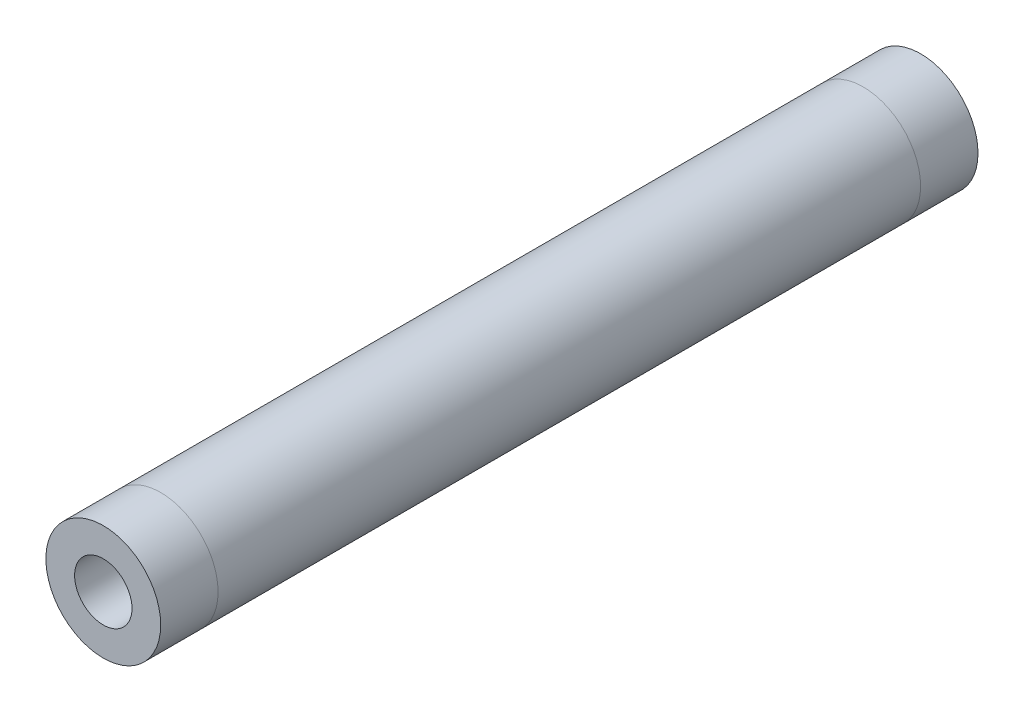
ISO-10303-21;
HEADER;
FILE_DESCRIPTION(('STEP AP214'),'2;1');
FILE_NAME('part.step','',(''),(''),'','','');
FILE_SCHEMA(('AUTOMOTIVE_DESIGN { 1 0 10303 214 1 1 1 1 }'));
ENDSEC;
DATA;
#1=APPLICATION_CONTEXT('core data for automotive mechanical design processes');
#2=APPLICATION_PROTOCOL_DEFINITION('international standard','automotive_design',2000,#1);
#3=PRODUCT_CONTEXT('',#1,'mechanical');
#4=PRODUCT('Part','Part','',(#3));
#5=PRODUCT_RELATED_PRODUCT_CATEGORY('part','',(#4));
#6=PRODUCT_DEFINITION_FORMATION('','',#4);
#7=PRODUCT_DEFINITION_CONTEXT('part definition',#1,'design');
#8=PRODUCT_DEFINITION('design','',#6,#7);
#9=PRODUCT_DEFINITION_SHAPE('','',#8);
#10=(LENGTH_UNIT() NAMED_UNIT(*) SI_UNIT(.MILLI.,.METRE.));
#11=(NAMED_UNIT(*) PLANE_ANGLE_UNIT() SI_UNIT($,.RADIAN.));
#12=(NAMED_UNIT(*) SI_UNIT($,.STERADIAN.) SOLID_ANGLE_UNIT());
#13=UNCERTAINTY_MEASURE_WITH_UNIT(LENGTH_MEASURE(1.E-05),#10,'distance_accuracy_value','');
#14=(GEOMETRIC_REPRESENTATION_CONTEXT(3) GLOBAL_UNCERTAINTY_ASSIGNED_CONTEXT((#13)) GLOBAL_UNIT_ASSIGNED_CONTEXT((#10,
#11,#12)) REPRESENTATION_CONTEXT('',''));
#15=CARTESIAN_POINT('',(0.,0.,0.));
#16=DIRECTION('',(0.,0.,1.));
#17=DIRECTION('',(1.,0.,0.));
#18=AXIS2_PLACEMENT_3D('',#15,#16,#17);
#19=CARTESIAN_POINT('',(0.,0.,-123.938697034138));
#20=DIRECTION('',(0.,0.,1.));
#21=DIRECTION('',(1.,0.,0.));
#22=AXIS2_PLACEMENT_3D('',#19,#20,#21);
#23=CYLINDRICAL_SURFACE('',#22,6.35);
#24=CARTESIAN_POINT('',(0.,0.,-105.978184792));
#25=DIRECTION('',(0.,0.,1.));
#26=DIRECTION('',(1.,0.,0.));
#27=AXIS2_PLACEMENT_3D('',#24,#25,#26);
#28=CIRCLE('',#27,6.35);
#29=CARTESIAN_POINT('',(6.35,0.,-105.978184792));
#30=VERTEX_POINT('',#29);
#31=EDGE_CURVE('E12',#30,#30,#28,.F.);
#32=ORIENTED_EDGE('',*,*,#31,.F.);
#33=EDGE_LOOP('',(#32));
#34=FACE_BOUND('',#33,.T.);
#35=CARTESIAN_POINT('',(0.,0.,-28.2575));
#36=DIRECTION('',(0.,0.,1.));
#37=DIRECTION('',(1.,0.,0.));
#38=AXIS2_PLACEMENT_3D('',#35,#36,#37);
#39=CIRCLE('',#38,6.35);
#40=CARTESIAN_POINT('',(6.35,0.,-28.2575));
#41=VERTEX_POINT('',#40);
#42=EDGE_CURVE('E78',#41,#41,#39,.T.);
#43=ORIENTED_EDGE('',*,*,#42,.F.);
#44=EDGE_LOOP('',(#43));
#45=FACE_BOUND('',#44,.T.);
#46=ADVANCED_FACE('F67',(#34,#45),#23,.T.);
#47=CARTESIAN_POINT('',(0.,0.,-28.2575));
#48=DIRECTION('',(0.,0.,1.));
#49=DIRECTION('',(1.,0.,0.));
#50=AXIS2_PLACEMENT_3D('',#47,#48,#49);
#51=PLANE('',#50);
#52=CARTESIAN_POINT('',(0.,0.,-28.2575));
#53=DIRECTION('',(0.,0.,1.));
#54=DIRECTION('',(1.,0.,0.));
#55=AXIS2_PLACEMENT_3D('',#52,#53,#54);
#56=CIRCLE('',#55,4.7625);
#57=CARTESIAN_POINT('',(4.7625,0.,-28.2575));
#58=VERTEX_POINT('',#57);
#59=EDGE_CURVE('E80',#58,#58,#56,.T.);
#60=ORIENTED_EDGE('',*,*,#59,.F.);
#61=EDGE_LOOP('',(#60));
#62=FACE_BOUND('',#61,.T.);
#63=ORIENTED_EDGE('',*,*,#42,.T.);
#64=EDGE_LOOP('',(#63));
#65=FACE_BOUND('',#64,.T.);
#66=ADVANCED_FACE('F85',(#62,#65),#51,.T.);
#67=CARTESIAN_POINT('',(0.,0.,-123.938697034138));
#68=DIRECTION('',(0.,0.,1.));
#69=DIRECTION('',(1.,0.,0.));
#70=AXIS2_PLACEMENT_3D('',#67,#68,#69);
#71=CYLINDRICAL_SURFACE('',#70,4.7625);
#72=CARTESIAN_POINT('',(0.,0.,-105.978184792));
#73=DIRECTION('',(0.,0.,1.));
#74=DIRECTION('',(1.,0.,0.));
#75=AXIS2_PLACEMENT_3D('',#72,#73,#74);
#76=CIRCLE('',#75,4.7625);
#77=CARTESIAN_POINT('',(4.7625,0.,-105.978184792));
#78=VERTEX_POINT('',#77);
#79=EDGE_CURVE('E70',#78,#78,#76,.F.);
#80=ORIENTED_EDGE('',*,*,#79,.T.);
#81=EDGE_LOOP('',(#80));
#82=FACE_BOUND('',#81,.T.);
#83=ORIENTED_EDGE('',*,*,#59,.T.);
#84=EDGE_LOOP('',(#83));
#85=FACE_BOUND('',#84,.T.);
#86=ADVANCED_FACE('F92',(#82,#85),#71,.F.);
#87=CARTESIAN_POINT('',(0.,0.,-105.978184792));
#88=DIRECTION('',(0.,0.,1.));
#89=DIRECTION('',(1.,0.,0.));
#90=AXIS2_PLACEMENT_3D('',#87,#88,#89);
#91=PLANE('',#90);
#92=ORIENTED_EDGE('',*,*,#31,.T.);
#93=EDGE_LOOP('',(#92));
#94=FACE_BOUND('',#93,.T.);
#95=ORIENTED_EDGE('',*,*,#79,.F.);
#96=EDGE_LOOP('',(#95));
#97=FACE_BOUND('',#96,.T.);
#98=ADVANCED_FACE('F97',(#94,#97),#91,.F.);
#99=CLOSED_SHELL('',(#46,#66,#86,#98));
#100=MANIFOLD_SOLID_BREP('B2',#99);
#101=CARTESIAN_POINT('',(0.,0.,-105.978184792));
#102=DIRECTION('',(0.,0.,1.));
#103=DIRECTION('',(1.,0.,0.));
#104=AXIS2_PLACEMENT_3D('',#101,#102,#103);
#105=PLANE('',#104);
#106=CARTESIAN_POINT('',(0.,0.,-105.978184792));
#107=DIRECTION('',(0.,0.,1.));
#108=DIRECTION('',(1.,0.,0.));
#109=AXIS2_PLACEMENT_3D('',#106,#107,#108);
#110=CIRCLE('',#109,6.35);
#111=CARTESIAN_POINT('',(6.35,0.,-105.978184792));
#112=VERTEX_POINT('',#111);
#113=EDGE_CURVE('E66',#112,#112,#110,.T.);
#114=ORIENTED_EDGE('',*,*,#113,.T.);
#115=EDGE_LOOP('',(#114));
#116=FACE_BOUND('',#115,.T.);
#117=CARTESIAN_POINT('',(0.,0.,-105.978184792));
#118=DIRECTION('',(0.,0.,1.));
#119=DIRECTION('',(1.,0.,0.));
#120=AXIS2_PLACEMENT_3D('',#117,#118,#119);
#121=CIRCLE('',#120,4.7625);
#122=CARTESIAN_POINT('',(4.7625,0.,-105.978184792));
#123=VERTEX_POINT('',#122);
#124=EDGE_CURVE('E149',#123,#123,#121,.T.);
#125=ORIENTED_EDGE('',*,*,#124,.F.);
#126=EDGE_LOOP('',(#125));
#127=FACE_BOUND('',#126,.T.);
#128=ADVANCED_FACE('F135',(#116,#127),#105,.T.);
#129=CARTESIAN_POINT('',(0.,0.,-105.978184792));
#130=DIRECTION('',(0.,0.,-1.));
#131=DIRECTION('',(-1.,0.,0.));
#132=AXIS2_PLACEMENT_3D('',#129,#130,#131);
#133=CYLINDRICAL_SURFACE('',#132,6.35);
#134=ORIENTED_EDGE('',*,*,#113,.F.);
#135=EDGE_LOOP('',(#134));
#136=FACE_BOUND('',#135,.T.);
#137=CARTESIAN_POINT('',(0.,0.,-112.328184792));
#138=DIRECTION('',(0.,0.,1.));
#139=DIRECTION('',(1.,0.,0.));
#140=AXIS2_PLACEMENT_3D('',#137,#138,#139);
#141=CIRCLE('',#140,6.35);
#142=CARTESIAN_POINT('',(6.35,0.,-112.328184792));
#143=VERTEX_POINT('',#142);
#144=EDGE_CURVE('E147',#143,#143,#141,.T.);
#145=ORIENTED_EDGE('',*,*,#144,.T.);
#146=EDGE_LOOP('',(#145));
#147=FACE_BOUND('',#146,.T.);
#148=ADVANCED_FACE('F137',(#136,#147),#133,.T.);
#149=CARTESIAN_POINT('',(0.,0.,-105.978184792));
#150=DIRECTION('',(0.,0.,-1.));
#151=DIRECTION('',(-1.,0.,0.));
#152=AXIS2_PLACEMENT_3D('',#149,#150,#151);
#153=CYLINDRICAL_SURFACE('',#152,3.175);
#154=CARTESIAN_POINT('',(0.,0.,-112.328184792));
#155=DIRECTION('',(0.,0.,1.));
#156=DIRECTION('',(1.,0.,0.));
#157=AXIS2_PLACEMENT_3D('',#154,#155,#156);
#158=CIRCLE('',#157,3.175);
#159=CARTESIAN_POINT('',(3.175,0.,-112.328184792));
#160=VERTEX_POINT('',#159);
#161=EDGE_CURVE('E139',#160,#160,#158,.T.);
#162=ORIENTED_EDGE('',*,*,#161,.F.);
#163=EDGE_LOOP('',(#162));
#164=FACE_BOUND('',#163,.T.);
#165=CARTESIAN_POINT('',(0.,0.,-99.628184792));
#166=DIRECTION('',(0.,0.,1.));
#167=DIRECTION('',(1.,0.,0.));
#168=AXIS2_PLACEMENT_3D('',#165,#166,#167);
#169=CIRCLE('',#168,3.175);
#170=CARTESIAN_POINT('',(3.175,0.,-99.628184792));
#171=VERTEX_POINT('',#170);
#172=EDGE_CURVE('E159',#171,#171,#169,.T.);
#173=ORIENTED_EDGE('',*,*,#172,.T.);
#174=EDGE_LOOP('',(#173));
#175=FACE_BOUND('',#174,.T.);
#176=ADVANCED_FACE('F164',(#164,#175),#153,.F.);
#177=CARTESIAN_POINT('',(0.,0.,-112.328184792));
#178=DIRECTION('',(0.,0.,1.));
#179=DIRECTION('',(1.,0.,0.));
#180=AXIS2_PLACEMENT_3D('',#177,#178,#179);
#181=PLANE('',#180);
#182=ORIENTED_EDGE('',*,*,#144,.F.);
#183=EDGE_LOOP('',(#182));
#184=FACE_BOUND('',#183,.T.);
#185=ORIENTED_EDGE('',*,*,#161,.T.);
#186=EDGE_LOOP('',(#185));
#187=FACE_BOUND('',#186,.T.);
#188=ADVANCED_FACE('F169',(#184,#187),#181,.F.);
#189=CARTESIAN_POINT('',(0.,0.,-99.628184792));
#190=DIRECTION('',(0.,0.,1.));
#191=DIRECTION('',(1.,0.,0.));
#192=AXIS2_PLACEMENT_3D('',#189,#190,#191);
#193=PLANE('',#192);
#194=CARTESIAN_POINT('',(0.,0.,-99.628184792));
#195=DIRECTION('',(0.,0.,1.));
#196=DIRECTION('',(1.,0.,0.));
#197=AXIS2_PLACEMENT_3D('',#194,#195,#196);
#198=CIRCLE('',#197,4.7625);
#199=CARTESIAN_POINT('',(4.7625,0.,-99.628184792));
#200=VERTEX_POINT('',#199);
#201=EDGE_CURVE('E152',#200,#200,#198,.T.);
#202=ORIENTED_EDGE('',*,*,#201,.T.);
#203=EDGE_LOOP('',(#202));
#204=FACE_BOUND('',#203,.T.);
#205=ORIENTED_EDGE('',*,*,#172,.F.);
#206=EDGE_LOOP('',(#205));
#207=FACE_BOUND('',#206,.T.);
#208=ADVANCED_FACE('F166',(#204,#207),#193,.T.);
#209=CARTESIAN_POINT('',(0.,0.,-99.628184792));
#210=DIRECTION('',(0.,0.,-1.));
#211=DIRECTION('',(-1.,0.,0.));
#212=AXIS2_PLACEMENT_3D('',#209,#210,#211);
#213=CYLINDRICAL_SURFACE('',#212,4.7625);
#214=ORIENTED_EDGE('',*,*,#201,.F.);
#215=EDGE_LOOP('',(#214));
#216=FACE_BOUND('',#215,.T.);
#217=ORIENTED_EDGE('',*,*,#124,.T.);
#218=EDGE_LOOP('',(#217));
#219=FACE_BOUND('',#218,.T.);
#220=ADVANCED_FACE('F168',(#216,#219),#213,.T.);
#221=CLOSED_SHELL('',(#128,#148,#176,#188,#208,#220));
#222=MANIFOLD_SOLID_BREP('B7',#221);
#223=CARTESIAN_POINT('',(0.,0.,-28.2575));
#224=DIRECTION('',(0.,0.,1.));
#225=DIRECTION('',(1.,0.,0.));
#226=AXIS2_PLACEMENT_3D('',#223,#224,#225);
#227=CYLINDRICAL_SURFACE('',#226,6.35);
#228=CARTESIAN_POINT('',(0.,0.,-28.2575));
#229=DIRECTION('',(0.,0.,1.));
#230=DIRECTION('',(1.,0.,0.));
#231=AXIS2_PLACEMENT_3D('',#228,#229,#230);
#232=CIRCLE('',#231,6.35);
#233=CARTESIAN_POINT('',(6.35,0.,-28.2575));
#234=VERTEX_POINT('',#233);
#235=EDGE_CURVE('E134',#234,#234,#232,.T.);
#236=ORIENTED_EDGE('',*,*,#235,.T.);
#237=EDGE_LOOP('',(#236));
#238=FACE_BOUND('',#237,.T.);
#239=CARTESIAN_POINT('',(0.,0.,-21.9075));
#240=DIRECTION('',(0.,0.,1.));
#241=DIRECTION('',(1.,0.,0.));
#242=AXIS2_PLACEMENT_3D('',#239,#240,#241);
#243=CIRCLE('',#242,6.35);
#244=CARTESIAN_POINT('',(6.35,0.,-21.9075));
#245=VERTEX_POINT('',#244);
#246=EDGE_CURVE('E246',#245,#245,#243,.T.);
#247=ORIENTED_EDGE('',*,*,#246,.F.);
#248=EDGE_LOOP('',(#247));
#249=FACE_BOUND('',#248,.T.);
#250=ADVANCED_FACE('F235',(#238,#249),#227,.T.);
#251=CARTESIAN_POINT('',(0.,0.,-28.2575));
#252=DIRECTION('',(0.,0.,1.));
#253=DIRECTION('',(1.,0.,0.));
#254=AXIS2_PLACEMENT_3D('',#251,#252,#253);
#255=CYLINDRICAL_SURFACE('',#254,3.175);
#256=CARTESIAN_POINT('',(0.,0.,-21.9075));
#257=DIRECTION('',(0.,0.,1.));
#258=DIRECTION('',(1.,0.,0.));
#259=AXIS2_PLACEMENT_3D('',#256,#257,#258);
#260=CIRCLE('',#259,3.175);
#261=CARTESIAN_POINT('',(3.175,0.,-21.9075));
#262=VERTEX_POINT('',#261);
#263=EDGE_CURVE('E238',#262,#262,#260,.T.);
#264=ORIENTED_EDGE('',*,*,#263,.T.);
#265=EDGE_LOOP('',(#264));
#266=FACE_BOUND('',#265,.T.);
#267=CARTESIAN_POINT('',(0.,0.,-34.6075));
#268=DIRECTION('',(0.,0.,1.));
#269=DIRECTION('',(1.,0.,0.));
#270=AXIS2_PLACEMENT_3D('',#267,#268,#269);
#271=CIRCLE('',#270,3.175);
#272=CARTESIAN_POINT('',(3.175,0.,-34.6075));
#273=VERTEX_POINT('',#272);
#274=EDGE_CURVE('E258',#273,#273,#271,.T.);
#275=ORIENTED_EDGE('',*,*,#274,.F.);
#276=EDGE_LOOP('',(#275));
#277=FACE_BOUND('',#276,.T.);
#278=ADVANCED_FACE('F266',(#266,#277),#255,.F.);
#279=CARTESIAN_POINT('',(0.,0.,-28.2575));
#280=DIRECTION('',(0.,0.,1.));
#281=DIRECTION('',(1.,0.,0.));
#282=AXIS2_PLACEMENT_3D('',#279,#280,#281);
#283=PLANE('',#282);
#284=CARTESIAN_POINT('',(0.,0.,-28.2575));
#285=DIRECTION('',(0.,0.,1.));
#286=DIRECTION('',(1.,0.,0.));
#287=AXIS2_PLACEMENT_3D('',#284,#285,#286);
#288=CIRCLE('',#287,4.7625);
#289=CARTESIAN_POINT('',(4.7625,0.,-28.2575));
#290=VERTEX_POINT('',#289);
#291=EDGE_CURVE('E248',#290,#290,#288,.T.);
#292=ORIENTED_EDGE('',*,*,#291,.T.);
#293=EDGE_LOOP('',(#292));
#294=FACE_BOUND('',#293,.T.);
#295=ORIENTED_EDGE('',*,*,#235,.F.);
#296=EDGE_LOOP('',(#295));
#297=FACE_BOUND('',#296,.T.);
#298=ADVANCED_FACE('F268',(#294,#297),#283,.F.);
#299=CARTESIAN_POINT('',(0.,0.,-21.9075));
#300=DIRECTION('',(0.,0.,1.));
#301=DIRECTION('',(1.,0.,0.));
#302=AXIS2_PLACEMENT_3D('',#299,#300,#301);
#303=PLANE('',#302);
#304=ORIENTED_EDGE('',*,*,#246,.T.);
#305=EDGE_LOOP('',(#304));
#306=FACE_BOUND('',#305,.T.);
#307=ORIENTED_EDGE('',*,*,#263,.F.);
#308=EDGE_LOOP('',(#307));
#309=FACE_BOUND('',#308,.T.);
#310=ADVANCED_FACE('F274',(#306,#309),#303,.T.);
#311=CARTESIAN_POINT('',(0.,0.,-34.6075));
#312=DIRECTION('',(0.,0.,1.));
#313=DIRECTION('',(1.,0.,0.));
#314=AXIS2_PLACEMENT_3D('',#311,#312,#313);
#315=CYLINDRICAL_SURFACE('',#314,4.7625);
#316=CARTESIAN_POINT('',(0.,0.,-34.6075));
#317=DIRECTION('',(0.,0.,1.));
#318=DIRECTION('',(1.,0.,0.));
#319=AXIS2_PLACEMENT_3D('',#316,#317,#318);
#320=CIRCLE('',#319,4.7625);
#321=CARTESIAN_POINT('',(4.7625,0.,-34.6075));
#322=VERTEX_POINT('',#321);
#323=EDGE_CURVE('E251',#322,#322,#320,.T.);
#324=ORIENTED_EDGE('',*,*,#323,.T.);
#325=EDGE_LOOP('',(#324));
#326=FACE_BOUND('',#325,.T.);
#327=ORIENTED_EDGE('',*,*,#291,.F.);
#328=EDGE_LOOP('',(#327));
#329=FACE_BOUND('',#328,.T.);
#330=ADVANCED_FACE('F279',(#326,#329),#315,.T.);
#331=CARTESIAN_POINT('',(0.,0.,-34.6075));
#332=DIRECTION('',(0.,0.,1.));
#333=DIRECTION('',(1.,0.,0.));
#334=AXIS2_PLACEMENT_3D('',#331,#332,#333);
#335=PLANE('',#334);
#336=ORIENTED_EDGE('',*,*,#274,.T.);
#337=EDGE_LOOP('',(#336));
#338=FACE_BOUND('',#337,.T.);
#339=ORIENTED_EDGE('',*,*,#323,.F.);
#340=EDGE_LOOP('',(#339));
#341=FACE_BOUND('',#340,.T.);
#342=ADVANCED_FACE('F263',(#338,#341),#335,.F.);
#343=CLOSED_SHELL('',(#250,#278,#298,#310,#330,#342));
#344=MANIFOLD_SOLID_BREP('B61',#343);
#345=ADVANCED_BREP_SHAPE_REPRESENTATION('',(#18,#100,#222,#344),#14);
#346=SHAPE_DEFINITION_REPRESENTATION(#9,#345);
ENDSEC;
END-ISO-10303-21;
